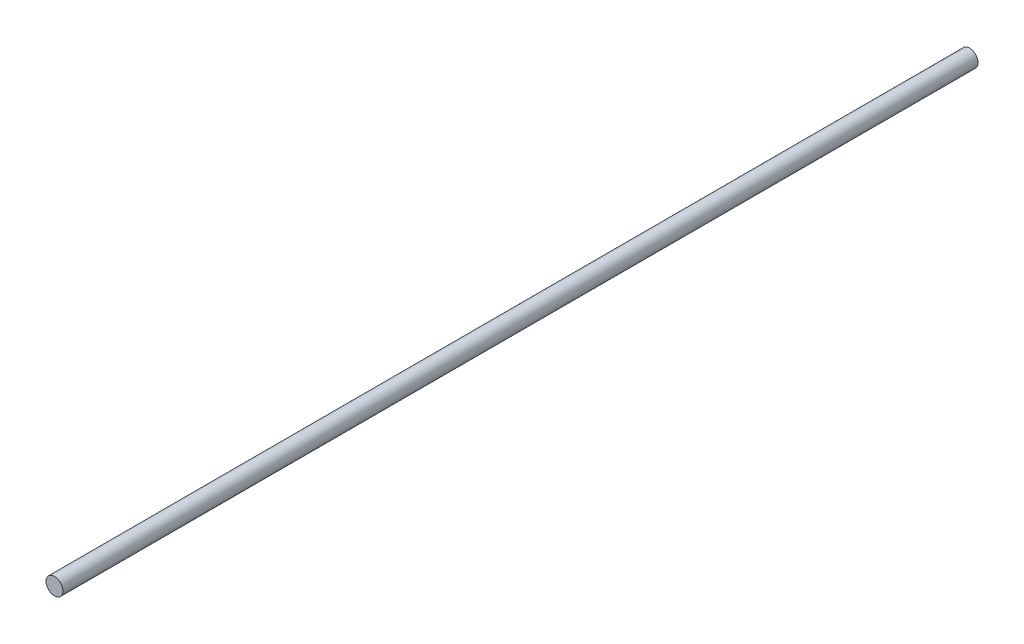
ISO-10303-21;
HEADER;
FILE_DESCRIPTION(('STEP AP214'),'2;1');
FILE_NAME('part.step','',(''),(''),'','','');
FILE_SCHEMA(('AUTOMOTIVE_DESIGN { 1 0 10303 214 1 1 1 1 }'));
ENDSEC;
DATA;
#1=APPLICATION_CONTEXT('core data for automotive mechanical design processes');
#2=APPLICATION_PROTOCOL_DEFINITION('international standard','automotive_design',2000,#1);
#3=PRODUCT_CONTEXT('',#1,'mechanical');
#4=PRODUCT('Part','Part','',(#3));
#5=PRODUCT_RELATED_PRODUCT_CATEGORY('part','',(#4));
#6=PRODUCT_DEFINITION_FORMATION('','',#4);
#7=PRODUCT_DEFINITION_CONTEXT('part definition',#1,'design');
#8=PRODUCT_DEFINITION('design','',#6,#7);
#9=PRODUCT_DEFINITION_SHAPE('','',#8);
#10=(LENGTH_UNIT() NAMED_UNIT(*) SI_UNIT(.MILLI.,.METRE.));
#11=(NAMED_UNIT(*) PLANE_ANGLE_UNIT() SI_UNIT($,.RADIAN.));
#12=(NAMED_UNIT(*) SI_UNIT($,.STERADIAN.) SOLID_ANGLE_UNIT());
#13=UNCERTAINTY_MEASURE_WITH_UNIT(LENGTH_MEASURE(1.E-05),#10,'distance_accuracy_value','');
#14=(GEOMETRIC_REPRESENTATION_CONTEXT(3) GLOBAL_UNCERTAINTY_ASSIGNED_CONTEXT((#13)) GLOBAL_UNIT_ASSIGNED_CONTEXT((#10,
#11,#12)) REPRESENTATION_CONTEXT('',''));
#15=CARTESIAN_POINT('',(0.,0.,0.));
#16=DIRECTION('',(0.,0.,1.));
#17=DIRECTION('',(1.,0.,0.));
#18=AXIS2_PLACEMENT_3D('',#15,#16,#17);
#19=CARTESIAN_POINT('',(0.,0.,433.));
#20=DIRECTION('',(0.,0.,-1.));
#21=DIRECTION('',(-1.,0.,0.));
#22=AXIS2_PLACEMENT_3D('',#19,#20,#21);
#23=CYLINDRICAL_SURFACE('',#22,4.);
#24=CARTESIAN_POINT('',(0.,0.,433.));
#25=DIRECTION('',(0.,0.,1.));
#26=DIRECTION('',(1.,0.,0.));
#27=AXIS2_PLACEMENT_3D('',#24,#25,#26);
#28=CIRCLE('',#27,4.);
#29=CARTESIAN_POINT('',(-4.,0.,433.));
#30=VERTEX_POINT('',#29);
#31=EDGE_CURVE('E10',#30,#30,#28,.T.);
#32=CARTESIAN_POINT('',(0.,0.,0.));
#33=DIRECTION('',(0.,0.,1.));
#34=DIRECTION('',(1.,0.,0.));
#35=AXIS2_PLACEMENT_3D('',#32,#33,#34);
#36=CIRCLE('',#35,4.);
#37=CARTESIAN_POINT('',(-4.,0.,0.));
#38=VERTEX_POINT('',#37);
#39=EDGE_CURVE('E35',#38,#38,#36,.T.);
#40=CARTESIAN_POINT('',(-4.,0.,433.));
#41=CARTESIAN_POINT('',(-4.,0.,428.489583333333));
#42=CARTESIAN_POINT('',(-4.,0.,423.979166666667));
#43=CARTESIAN_POINT('',(-4.,0.,414.958333333333));
#44=CARTESIAN_POINT('',(-4.,0.,410.447916666667));
#45=CARTESIAN_POINT('',(-4.,0.,401.427083333333));
#46=CARTESIAN_POINT('',(-4.,0.,396.916666666667));
#47=CARTESIAN_POINT('',(-4.,0.,387.895833333333));
#48=CARTESIAN_POINT('',(-4.,0.,383.385416666667));
#49=CARTESIAN_POINT('',(-4.,0.,374.364583333333));
#50=CARTESIAN_POINT('',(-4.,0.,369.854166666667));
#51=CARTESIAN_POINT('',(-4.,0.,360.833333333333));
#52=CARTESIAN_POINT('',(-4.,0.,356.322916666667));
#53=CARTESIAN_POINT('',(-4.,0.,347.302083333333));
#54=CARTESIAN_POINT('',(-4.,0.,342.791666666667));
#55=CARTESIAN_POINT('',(-4.,0.,333.770833333333));
#56=CARTESIAN_POINT('',(-4.,0.,329.260416666667));
#57=CARTESIAN_POINT('',(-4.,0.,320.239583333333));
#58=CARTESIAN_POINT('',(-4.,0.,315.729166666667));
#59=CARTESIAN_POINT('',(-4.,0.,306.708333333333));
#60=CARTESIAN_POINT('',(-4.,0.,302.197916666667));
#61=CARTESIAN_POINT('',(-4.,0.,293.177083333333));
#62=CARTESIAN_POINT('',(-4.,0.,288.666666666667));
#63=CARTESIAN_POINT('',(-4.,0.,279.645833333333));
#64=CARTESIAN_POINT('',(-4.,0.,275.135416666667));
#65=CARTESIAN_POINT('',(-4.,0.,266.114583333333));
#66=CARTESIAN_POINT('',(-4.,0.,261.604166666667));
#67=CARTESIAN_POINT('',(-4.,0.,252.583333333333));
#68=CARTESIAN_POINT('',(-4.,0.,248.072916666667));
#69=CARTESIAN_POINT('',(-4.,0.,239.052083333333));
#70=CARTESIAN_POINT('',(-4.,0.,234.541666666667));
#71=CARTESIAN_POINT('',(-4.,0.,225.520833333333));
#72=CARTESIAN_POINT('',(-4.,0.,221.010416666667));
#73=CARTESIAN_POINT('',(-4.,0.,211.989583333333));
#74=CARTESIAN_POINT('',(-4.,0.,207.479166666667));
#75=CARTESIAN_POINT('',(-4.,0.,198.458333333333));
#76=CARTESIAN_POINT('',(-4.,0.,193.947916666667));
#77=CARTESIAN_POINT('',(-4.,0.,184.927083333333));
#78=CARTESIAN_POINT('',(-4.,0.,180.416666666667));
#79=CARTESIAN_POINT('',(-4.,0.,171.395833333333));
#80=CARTESIAN_POINT('',(-4.,0.,166.885416666667));
#81=CARTESIAN_POINT('',(-4.,0.,157.864583333333));
#82=CARTESIAN_POINT('',(-4.,0.,153.354166666667));
#83=CARTESIAN_POINT('',(-4.,0.,144.333333333333));
#84=CARTESIAN_POINT('',(-4.,0.,139.822916666667));
#85=CARTESIAN_POINT('',(-4.,0.,130.802083333333));
#86=CARTESIAN_POINT('',(-4.,0.,126.291666666667));
#87=CARTESIAN_POINT('',(-4.,0.,117.270833333333));
#88=CARTESIAN_POINT('',(-4.,0.,112.760416666667));
#89=CARTESIAN_POINT('',(-4.,0.,103.739583333333));
#90=CARTESIAN_POINT('',(-4.,0.,99.2291666666667));
#91=CARTESIAN_POINT('',(-4.,0.,90.2083333333333));
#92=CARTESIAN_POINT('',(-4.,0.,85.6979166666667));
#93=CARTESIAN_POINT('',(-4.,0.,76.6770833333334));
#94=CARTESIAN_POINT('',(-4.,0.,72.1666666666667));
#95=CARTESIAN_POINT('',(-4.,0.,63.1458333333333));
#96=CARTESIAN_POINT('',(-4.,0.,58.6354166666667));
#97=CARTESIAN_POINT('',(-4.,0.,49.6145833333333));
#98=CARTESIAN_POINT('',(-4.,0.,45.1041666666667));
#99=CARTESIAN_POINT('',(-4.,0.,36.0833333333333));
#100=CARTESIAN_POINT('',(-4.,0.,31.5729166666667));
#101=CARTESIAN_POINT('',(-4.,0.,22.5520833333333));
#102=CARTESIAN_POINT('',(-4.,0.,18.0416666666667));
#103=CARTESIAN_POINT('',(-4.,0.,9.02083333333333));
#104=CARTESIAN_POINT('',(-4.,0.,4.51041666666666));
#105=CARTESIAN_POINT('',(-4.,0.,0.));
#106=B_SPLINE_CURVE_WITH_KNOTS('',3,(#40,#41,#42,#43,#44,#45,#46,#47,#48,#49,#50,#51,#52,#53,
#54,#55,#56,#57,#58,#59,#60,#61,#62,#63,#64,#65,#66,#67,#68,#69,#70,#71,#72,#73,#74,#75,#76,#77,
#78,#79,#80,#81,#82,#83,#84,#85,#86,#87,#88,#89,#90,#91,#92,#93,#94,#95,#96,#97,#98,#99,#100,
#101,#102,#103,#104,#105),.UNSPECIFIED.,.F.,.F.,(4,2,2,2,2,2,2,2,2,2,2,2,2,2,2,2,2,2,2,2,2,2,2,
2,2,2,2,2,2,2,2,2,4),(0.,13.53125,27.0625,40.59375,54.125,67.65625,81.1875,94.71875,108.25,
121.78125,135.3125,148.84375,162.375,175.90625,189.4375,202.96875,216.5,230.03125,243.5625,
257.09375,270.625,284.15625,297.6875,311.21875,324.75,338.28125,351.8125,365.34375,378.875,
392.40625,405.9375,419.46875,433.),.UNSPECIFIED.);
#107=EDGE_CURVE('BSEAM32',#30,#38,#106,.T.);
#108=ORIENTED_EDGE('',*,*,#31,.F.);
#109=ORIENTED_EDGE('',*,*,#39,.T.);
#110=ORIENTED_EDGE('',*,*,#107,.T.);
#111=ORIENTED_EDGE('',*,*,#107,.F.);
#112=EDGE_LOOP('',(#108,#110,#109,#111));
#113=FACE_BOUND('',#112,.T.);
#114=ADVANCED_FACE('F32',(#113),#23,.T.);
#115=CARTESIAN_POINT('',(0.,0.,433.));
#116=DIRECTION('',(0.,0.,1.));
#117=DIRECTION('',(1.,0.,0.));
#118=AXIS2_PLACEMENT_3D('',#115,#116,#117);
#119=PLANE('',#118);
#120=ORIENTED_EDGE('',*,*,#31,.T.);
#121=EDGE_LOOP('',(#120));
#122=FACE_BOUND('',#121,.T.);
#123=ADVANCED_FACE('F47',(#122),#119,.T.);
#124=CARTESIAN_POINT('',(0.,0.,0.));
#125=DIRECTION('',(0.,0.,1.));
#126=DIRECTION('',(1.,0.,0.));
#127=AXIS2_PLACEMENT_3D('',#124,#125,#126);
#128=PLANE('',#127);
#129=ORIENTED_EDGE('',*,*,#39,.F.);
#130=EDGE_LOOP('',(#129));
#131=FACE_BOUND('',#130,.T.);
#132=ADVANCED_FACE('F45',(#131),#128,.F.);
#133=CLOSED_SHELL('',(#114,#123,#132));
#134=MANIFOLD_SOLID_BREP('B2',#133);
#135=ADVANCED_BREP_SHAPE_REPRESENTATION('',(#18,#134),#14);
#136=SHAPE_DEFINITION_REPRESENTATION(#9,#135);
ENDSEC;
END-ISO-10303-21;
